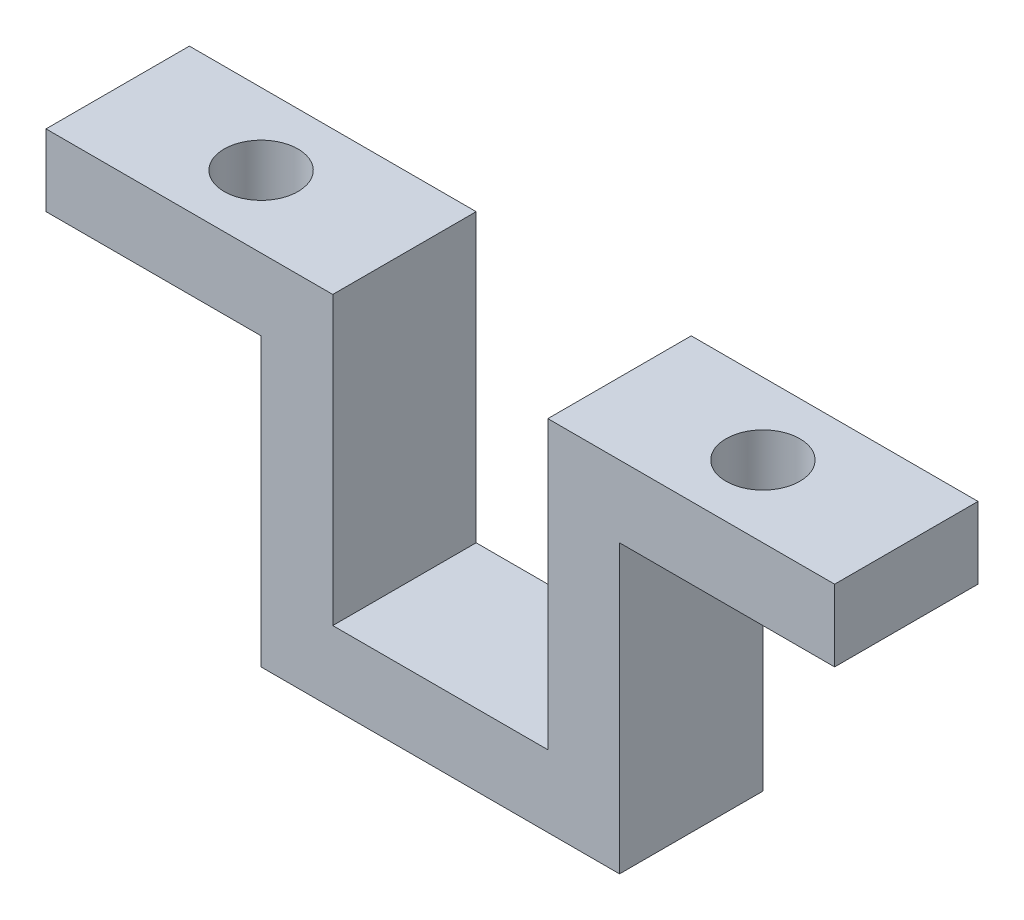
ISO-10303-21;
HEADER;
FILE_DESCRIPTION(('STEP AP214'),'2;1');
FILE_NAME('part.step','',(''),(''),'','','');
FILE_SCHEMA(('AUTOMOTIVE_DESIGN { 1 0 10303 214 1 1 1 1 }'));
ENDSEC;
DATA;
#1=APPLICATION_CONTEXT('core data for automotive mechanical design processes');
#2=APPLICATION_PROTOCOL_DEFINITION('international standard','automotive_design',2000,#1);
#3=PRODUCT_CONTEXT('',#1,'mechanical');
#4=PRODUCT('Part','Part','',(#3));
#5=PRODUCT_RELATED_PRODUCT_CATEGORY('part','',(#4));
#6=PRODUCT_DEFINITION_FORMATION('','',#4);
#7=PRODUCT_DEFINITION_CONTEXT('part definition',#1,'design');
#8=PRODUCT_DEFINITION('design','',#6,#7);
#9=PRODUCT_DEFINITION_SHAPE('','',#8);
#10=(LENGTH_UNIT() NAMED_UNIT(*) SI_UNIT(.MILLI.,.METRE.));
#11=(NAMED_UNIT(*) PLANE_ANGLE_UNIT() SI_UNIT($,.RADIAN.));
#12=(NAMED_UNIT(*) SI_UNIT($,.STERADIAN.) SOLID_ANGLE_UNIT());
#13=UNCERTAINTY_MEASURE_WITH_UNIT(LENGTH_MEASURE(1.E-05),#10,'distance_accuracy_value','');
#14=(GEOMETRIC_REPRESENTATION_CONTEXT(3) GLOBAL_UNCERTAINTY_ASSIGNED_CONTEXT((#13)) GLOBAL_UNIT_ASSIGNED_CONTEXT((#10,
#11,#12)) REPRESENTATION_CONTEXT('',''));
#15=CARTESIAN_POINT('',(0.,0.,0.));
#16=DIRECTION('',(0.,0.,1.));
#17=DIRECTION('',(1.,0.,0.));
#18=AXIS2_PLACEMENT_3D('',#15,#16,#17);
#19=CARTESIAN_POINT('',(20.,0.,10.));
#20=DIRECTION('',(-1.,0.,0.));
#21=DIRECTION('',(0.,-1.,0.));
#22=AXIS2_PLACEMENT_3D('',#19,#20,#21);
#23=PLANE('',#22);
#24=DIRECTION('',(0.,1.,0.));
#25=VECTOR('',#24,1.);
#26=CARTESIAN_POINT('',(20.,0.,0.));
#27=LINE('',#26,#25);
#28=CARTESIAN_POINT('',(20.,-20.,0.));
#29=VERTEX_POINT('',#28);
#30=CARTESIAN_POINT('',(20.,0.,0.));
#31=VERTEX_POINT('',#30);
#32=EDGE_CURVE('E169',#29,#31,#27,.T.);
#33=ORIENTED_EDGE('',*,*,#32,.T.);
#34=DIRECTION('',(0.,0.,-1.));
#35=VECTOR('',#34,1.);
#36=CARTESIAN_POINT('',(20.,0.,10.));
#37=LINE('',#36,#35);
#38=CARTESIAN_POINT('',(20.,0.,10.));
#39=VERTEX_POINT('',#38);
#40=EDGE_CURVE('E11',#39,#31,#37,.T.);
#41=ORIENTED_EDGE('',*,*,#40,.F.);
#42=DIRECTION('',(0.,1.,0.));
#43=VECTOR('',#42,1.);
#44=CARTESIAN_POINT('',(20.,0.,10.));
#45=LINE('',#44,#43);
#46=CARTESIAN_POINT('',(20.,-20.,10.));
#47=VERTEX_POINT('',#46);
#48=EDGE_CURVE('E203',#47,#39,#45,.T.);
#49=ORIENTED_EDGE('',*,*,#48,.F.);
#50=DIRECTION('',(0.,0.,-1.));
#51=VECTOR('',#50,1.);
#52=CARTESIAN_POINT('',(20.,-20.,10.));
#53=LINE('',#52,#51);
#54=EDGE_CURVE('E165',#47,#29,#53,.T.);
#55=ORIENTED_EDGE('',*,*,#54,.T.);
#56=EDGE_LOOP('',(#33,#41,#49,#55));
#57=FACE_BOUND('',#56,.T.);
#58=ADVANCED_FACE('F43',(#57),#23,.F.);
#59=CARTESIAN_POINT('',(0.,0.,10.));
#60=DIRECTION('',(0.,-1.,0.));
#61=DIRECTION('',(1.,0.,0.));
#62=AXIS2_PLACEMENT_3D('',#59,#60,#61);
#63=PLANE('',#62);
#64=CARTESIAN_POINT('',(10.,0.,5.));
#65=DIRECTION('',(0.,1.,0.));
#66=DIRECTION('',(-1.,0.,0.));
#67=AXIS2_PLACEMENT_3D('',#64,#65,#66);
#68=CIRCLE('',#67,2.575);
#69=CARTESIAN_POINT('',(7.425,0.,5.));
#70=VERTEX_POINT('',#69);
#71=EDGE_CURVE('E336',#70,#70,#68,.T.);
#72=ORIENTED_EDGE('',*,*,#71,.F.);
#73=EDGE_LOOP('',(#72));
#74=FACE_BOUND('',#73,.T.);
#75=DIRECTION('',(-1.,0.,0.));
#76=VECTOR('',#75,1.);
#77=CARTESIAN_POINT('',(0.,0.,0.));
#78=LINE('',#77,#76);
#79=CARTESIAN_POINT('',(0.,0.,0.));
#80=VERTEX_POINT('',#79);
#81=EDGE_CURVE('E173',#31,#80,#78,.T.);
#82=ORIENTED_EDGE('',*,*,#81,.T.);
#83=DIRECTION('',(0.,0.,-1.));
#84=VECTOR('',#83,1.);
#85=CARTESIAN_POINT('',(0.,0.,10.));
#86=LINE('',#85,#84);
#87=CARTESIAN_POINT('',(0.,0.,10.));
#88=VERTEX_POINT('',#87);
#89=EDGE_CURVE('E53',#88,#80,#86,.T.);
#90=ORIENTED_EDGE('',*,*,#89,.F.);
#91=DIRECTION('',(-1.,0.,0.));
#92=VECTOR('',#91,1.);
#93=CARTESIAN_POINT('',(0.,0.,10.));
#94=LINE('',#93,#92);
#95=EDGE_CURVE('E116',#39,#88,#94,.T.);
#96=ORIENTED_EDGE('',*,*,#95,.F.);
#97=ORIENTED_EDGE('',*,*,#40,.T.);
#98=EDGE_LOOP('',(#82,#90,#96,#97));
#99=FACE_BOUND('',#98,.T.);
#100=ADVANCED_FACE('F298',(#74,#99),#63,.F.);
#101=CARTESIAN_POINT('',(0.,0.,10.));
#102=DIRECTION('',(1.,0.,0.));
#103=DIRECTION('',(0.,1.,0.));
#104=AXIS2_PLACEMENT_3D('',#101,#102,#103);
#105=PLANE('',#104);
#106=DIRECTION('',(0.,-1.,0.));
#107=VECTOR('',#106,1.);
#108=CARTESIAN_POINT('',(0.,0.,0.));
#109=LINE('',#108,#107);
#110=CARTESIAN_POINT('',(0.,-5.,0.));
#111=VERTEX_POINT('',#110);
#112=EDGE_CURVE('E176',#80,#111,#109,.T.);
#113=ORIENTED_EDGE('',*,*,#112,.T.);
#114=DIRECTION('',(0.,0.,-1.));
#115=VECTOR('',#114,1.);
#116=CARTESIAN_POINT('',(0.,-5.,10.));
#117=LINE('',#116,#115);
#118=CARTESIAN_POINT('',(0.,-5.,10.));
#119=VERTEX_POINT('',#118);
#120=EDGE_CURVE('E230',#119,#111,#117,.T.);
#121=ORIENTED_EDGE('',*,*,#120,.F.);
#122=DIRECTION('',(0.,-1.,0.));
#123=VECTOR('',#122,1.);
#124=CARTESIAN_POINT('',(0.,0.,10.));
#125=LINE('',#124,#123);
#126=EDGE_CURVE('E241',#88,#119,#125,.T.);
#127=ORIENTED_EDGE('',*,*,#126,.F.);
#128=ORIENTED_EDGE('',*,*,#89,.T.);
#129=EDGE_LOOP('',(#113,#121,#127,#128));
#130=FACE_BOUND('',#129,.T.);
#131=ADVANCED_FACE('F239',(#130),#105,.F.);
#132=CARTESIAN_POINT('',(15.,-5.,10.));
#133=DIRECTION('',(0.,1.,0.));
#134=DIRECTION('',(-1.,0.,0.));
#135=AXIS2_PLACEMENT_3D('',#132,#133,#134);
#136=PLANE('',#135);
#137=CARTESIAN_POINT('',(10.,-5.,5.));
#138=DIRECTION('',(0.,1.,0.));
#139=DIRECTION('',(-1.,0.,0.));
#140=AXIS2_PLACEMENT_3D('',#137,#138,#139);
#141=CIRCLE('',#140,2.575);
#142=CARTESIAN_POINT('',(7.425,-5.,5.));
#143=VERTEX_POINT('',#142);
#144=EDGE_CURVE('E46',#143,#143,#141,.T.);
#145=ORIENTED_EDGE('',*,*,#144,.T.);
#146=EDGE_LOOP('',(#145));
#147=FACE_BOUND('',#146,.T.);
#148=DIRECTION('',(1.,0.,0.));
#149=VECTOR('',#148,1.);
#150=CARTESIAN_POINT('',(15.,-5.,0.));
#151=LINE('',#150,#149);
#152=CARTESIAN_POINT('',(15.,-5.,0.));
#153=VERTEX_POINT('',#152);
#154=EDGE_CURVE('E179',#111,#153,#151,.T.);
#155=ORIENTED_EDGE('',*,*,#154,.T.);
#156=DIRECTION('',(0.,0.,-1.));
#157=VECTOR('',#156,1.);
#158=CARTESIAN_POINT('',(15.,-5.,10.));
#159=LINE('',#158,#157);
#160=CARTESIAN_POINT('',(15.,-5.,10.));
#161=VERTEX_POINT('',#160);
#162=EDGE_CURVE('E226',#161,#153,#159,.T.);
#163=ORIENTED_EDGE('',*,*,#162,.F.);
#164=DIRECTION('',(1.,0.,0.));
#165=VECTOR('',#164,1.);
#166=CARTESIAN_POINT('',(15.,-5.,10.));
#167=LINE('',#166,#165);
#168=EDGE_CURVE('E260',#119,#161,#167,.T.);
#169=ORIENTED_EDGE('',*,*,#168,.F.);
#170=ORIENTED_EDGE('',*,*,#120,.T.);
#171=EDGE_LOOP('',(#155,#163,#169,#170));
#172=FACE_BOUND('',#171,.T.);
#173=ADVANCED_FACE('F250',(#147,#172),#136,.F.);
#174=CARTESIAN_POINT('',(15.,-25.,10.));
#175=DIRECTION('',(1.,0.,0.));
#176=DIRECTION('',(0.,0.,-1.));
#177=AXIS2_PLACEMENT_3D('',#174,#175,#176);
#178=PLANE('',#177);
#179=DIRECTION('',(0.,-1.,0.));
#180=VECTOR('',#179,1.);
#181=CARTESIAN_POINT('',(15.,-25.,0.));
#182=LINE('',#181,#180);
#183=CARTESIAN_POINT('',(15.,-25.,0.));
#184=VERTEX_POINT('',#183);
#185=EDGE_CURVE('E182',#153,#184,#182,.T.);
#186=ORIENTED_EDGE('',*,*,#185,.T.);
#187=DIRECTION('',(0.,0.,-1.));
#188=VECTOR('',#187,1.);
#189=CARTESIAN_POINT('',(15.,-25.,10.));
#190=LINE('',#189,#188);
#191=CARTESIAN_POINT('',(15.,-25.,10.));
#192=VERTEX_POINT('',#191);
#193=EDGE_CURVE('E222',#192,#184,#190,.T.);
#194=ORIENTED_EDGE('',*,*,#193,.F.);
#195=DIRECTION('',(0.,-1.,0.));
#196=VECTOR('',#195,1.);
#197=CARTESIAN_POINT('',(15.,-25.,10.));
#198=LINE('',#197,#196);
#199=EDGE_CURVE('E256',#161,#192,#198,.T.);
#200=ORIENTED_EDGE('',*,*,#199,.F.);
#201=ORIENTED_EDGE('',*,*,#162,.T.);
#202=EDGE_LOOP('',(#186,#194,#200,#201));
#203=FACE_BOUND('',#202,.T.);
#204=ADVANCED_FACE('F254',(#203),#178,.F.);
#205=CARTESIAN_POINT('',(40.,-25.,10.));
#206=DIRECTION('',(0.,1.,0.));
#207=DIRECTION('',(-1.,0.,0.));
#208=AXIS2_PLACEMENT_3D('',#205,#206,#207);
#209=PLANE('',#208);
#210=DIRECTION('',(1.,0.,0.));
#211=VECTOR('',#210,1.);
#212=CARTESIAN_POINT('',(40.,-25.,0.));
#213=LINE('',#212,#211);
#214=CARTESIAN_POINT('',(40.,-25.,0.));
#215=VERTEX_POINT('',#214);
#216=EDGE_CURVE('E185',#184,#215,#213,.T.);
#217=ORIENTED_EDGE('',*,*,#216,.T.);
#218=DIRECTION('',(0.,0.,-1.));
#219=VECTOR('',#218,1.);
#220=CARTESIAN_POINT('',(40.,-25.,10.));
#221=LINE('',#220,#219);
#222=CARTESIAN_POINT('',(40.,-25.,10.));
#223=VERTEX_POINT('',#222);
#224=EDGE_CURVE('E218',#223,#215,#221,.T.);
#225=ORIENTED_EDGE('',*,*,#224,.F.);
#226=DIRECTION('',(1.,0.,0.));
#227=VECTOR('',#226,1.);
#228=CARTESIAN_POINT('',(40.,-25.,10.));
#229=LINE('',#228,#227);
#230=EDGE_CURVE('E259',#192,#223,#229,.T.);
#231=ORIENTED_EDGE('',*,*,#230,.F.);
#232=ORIENTED_EDGE('',*,*,#193,.T.);
#233=EDGE_LOOP('',(#217,#225,#231,#232));
#234=FACE_BOUND('',#233,.T.);
#235=ADVANCED_FACE('F314',(#234),#209,.F.);
#236=CARTESIAN_POINT('',(40.,-5.,10.));
#237=DIRECTION('',(-1.,0.,0.));
#238=DIRECTION('',(0.,0.,1.));
#239=AXIS2_PLACEMENT_3D('',#236,#237,#238);
#240=PLANE('',#239);
#241=DIRECTION('',(0.,1.,0.));
#242=VECTOR('',#241,1.);
#243=CARTESIAN_POINT('',(40.,-5.,0.));
#244=LINE('',#243,#242);
#245=CARTESIAN_POINT('',(40.,-5.,0.));
#246=VERTEX_POINT('',#245);
#247=EDGE_CURVE('E188',#215,#246,#244,.T.);
#248=ORIENTED_EDGE('',*,*,#247,.T.);
#249=DIRECTION('',(0.,0.,-1.));
#250=VECTOR('',#249,1.);
#251=CARTESIAN_POINT('',(40.,-5.,10.));
#252=LINE('',#251,#250);
#253=CARTESIAN_POINT('',(40.,-5.,10.));
#254=VERTEX_POINT('',#253);
#255=EDGE_CURVE('E214',#254,#246,#252,.T.);
#256=ORIENTED_EDGE('',*,*,#255,.F.);
#257=DIRECTION('',(0.,1.,0.));
#258=VECTOR('',#257,1.);
#259=CARTESIAN_POINT('',(40.,-5.,10.));
#260=LINE('',#259,#258);
#261=EDGE_CURVE('E264',#223,#254,#260,.T.);
#262=ORIENTED_EDGE('',*,*,#261,.F.);
#263=ORIENTED_EDGE('',*,*,#224,.T.);
#264=EDGE_LOOP('',(#248,#256,#262,#263));
#265=FACE_BOUND('',#264,.T.);
#266=ADVANCED_FACE('F317',(#265),#240,.F.);
#267=CARTESIAN_POINT('',(40.,-5.,10.));
#268=DIRECTION('',(0.,1.,0.));
#269=DIRECTION('',(-1.,0.,0.));
#270=AXIS2_PLACEMENT_3D('',#267,#268,#269);
#271=PLANE('',#270);
#272=CARTESIAN_POINT('',(45.,-5.,5.));
#273=DIRECTION('',(0.,1.,0.));
#274=DIRECTION('',(-1.,0.,0.));
#275=AXIS2_PLACEMENT_3D('',#272,#273,#274);
#276=CIRCLE('',#275,2.57500000000001);
#277=CARTESIAN_POINT('',(42.425,-5.,5.));
#278=VERTEX_POINT('',#277);
#279=EDGE_CURVE('E340',#278,#278,#276,.T.);
#280=ORIENTED_EDGE('',*,*,#279,.T.);
#281=EDGE_LOOP('',(#280));
#282=FACE_BOUND('',#281,.T.);
#283=DIRECTION('',(1.,0.,0.));
#284=VECTOR('',#283,1.);
#285=CARTESIAN_POINT('',(40.,-5.,0.));
#286=LINE('',#285,#284);
#287=CARTESIAN_POINT('',(55.,-5.,0.));
#288=VERTEX_POINT('',#287);
#289=EDGE_CURVE('E191',#246,#288,#286,.T.);
#290=ORIENTED_EDGE('',*,*,#289,.T.);
#291=DIRECTION('',(0.,0.,-1.));
#292=VECTOR('',#291,1.);
#293=CARTESIAN_POINT('',(55.,-5.,10.));
#294=LINE('',#293,#292);
#295=CARTESIAN_POINT('',(55.,-5.,10.));
#296=VERTEX_POINT('',#295);
#297=EDGE_CURVE('E210',#296,#288,#294,.T.);
#298=ORIENTED_EDGE('',*,*,#297,.F.);
#299=DIRECTION('',(1.,0.,0.));
#300=VECTOR('',#299,1.);
#301=CARTESIAN_POINT('',(40.,-5.,10.));
#302=LINE('',#301,#300);
#303=EDGE_CURVE('E271',#254,#296,#302,.T.);
#304=ORIENTED_EDGE('',*,*,#303,.F.);
#305=ORIENTED_EDGE('',*,*,#255,.T.);
#306=EDGE_LOOP('',(#290,#298,#304,#305));
#307=FACE_BOUND('',#306,.T.);
#308=ADVANCED_FACE('F279',(#282,#307),#271,.F.);
#309=CARTESIAN_POINT('',(55.,0.,10.));
#310=DIRECTION('',(-1.,0.,0.));
#311=DIRECTION('',(0.,0.,1.));
#312=AXIS2_PLACEMENT_3D('',#309,#310,#311);
#313=PLANE('',#312);
#314=DIRECTION('',(0.,1.,0.));
#315=VECTOR('',#314,1.);
#316=CARTESIAN_POINT('',(55.,0.,0.));
#317=LINE('',#316,#315);
#318=CARTESIAN_POINT('',(55.,0.,0.));
#319=VERTEX_POINT('',#318);
#320=EDGE_CURVE('E194',#288,#319,#317,.T.);
#321=ORIENTED_EDGE('',*,*,#320,.T.);
#322=DIRECTION('',(0.,0.,-1.));
#323=VECTOR('',#322,1.);
#324=CARTESIAN_POINT('',(55.,0.,10.));
#325=LINE('',#324,#323);
#326=CARTESIAN_POINT('',(55.,0.,10.));
#327=VERTEX_POINT('',#326);
#328=EDGE_CURVE('E158',#327,#319,#325,.T.);
#329=ORIENTED_EDGE('',*,*,#328,.F.);
#330=DIRECTION('',(0.,1.,0.));
#331=VECTOR('',#330,1.);
#332=CARTESIAN_POINT('',(55.,0.,10.));
#333=LINE('',#332,#331);
#334=EDGE_CURVE('E147',#296,#327,#333,.T.);
#335=ORIENTED_EDGE('',*,*,#334,.F.);
#336=ORIENTED_EDGE('',*,*,#297,.T.);
#337=EDGE_LOOP('',(#321,#329,#335,#336));
#338=FACE_BOUND('',#337,.T.);
#339=ADVANCED_FACE('F283',(#338),#313,.F.);
#340=CARTESIAN_POINT('',(35.,0.,10.));
#341=DIRECTION('',(0.,-1.,0.));
#342=DIRECTION('',(1.,0.,0.));
#343=AXIS2_PLACEMENT_3D('',#340,#341,#342);
#344=PLANE('',#343);
#345=CARTESIAN_POINT('',(45.,0.,5.));
#346=DIRECTION('',(0.,1.,0.));
#347=DIRECTION('',(1.,0.,0.));
#348=AXIS2_PLACEMENT_3D('',#345,#346,#347);
#349=CIRCLE('',#348,2.57500000000001);
#350=CARTESIAN_POINT('',(47.575,0.,5.));
#351=VERTEX_POINT('',#350);
#352=EDGE_CURVE('E333',#351,#351,#349,.T.);
#353=ORIENTED_EDGE('',*,*,#352,.F.);
#354=EDGE_LOOP('',(#353));
#355=FACE_BOUND('',#354,.T.);
#356=DIRECTION('',(-1.,0.,0.));
#357=VECTOR('',#356,1.);
#358=CARTESIAN_POINT('',(35.,0.,0.));
#359=LINE('',#358,#357);
#360=CARTESIAN_POINT('',(35.,0.,0.));
#361=VERTEX_POINT('',#360);
#362=EDGE_CURVE('E156',#319,#361,#359,.T.);
#363=ORIENTED_EDGE('',*,*,#362,.T.);
#364=DIRECTION('',(0.,0.,-1.));
#365=VECTOR('',#364,1.);
#366=CARTESIAN_POINT('',(35.,0.,10.));
#367=LINE('',#366,#365);
#368=CARTESIAN_POINT('',(35.,0.,10.));
#369=VERTEX_POINT('',#368);
#370=EDGE_CURVE('E153',#369,#361,#367,.T.);
#371=ORIENTED_EDGE('',*,*,#370,.F.);
#372=DIRECTION('',(-1.,0.,0.));
#373=VECTOR('',#372,1.);
#374=CARTESIAN_POINT('',(35.,0.,10.));
#375=LINE('',#374,#373);
#376=EDGE_CURVE('E141',#327,#369,#375,.T.);
#377=ORIENTED_EDGE('',*,*,#376,.F.);
#378=ORIENTED_EDGE('',*,*,#328,.T.);
#379=EDGE_LOOP('',(#363,#371,#377,#378));
#380=FACE_BOUND('',#379,.T.);
#381=ADVANCED_FACE('F154',(#355,#380),#344,.F.);
#382=CARTESIAN_POINT('',(35.,-20.,10.));
#383=DIRECTION('',(1.,0.,0.));
#384=DIRECTION('',(0.,0.,-1.));
#385=AXIS2_PLACEMENT_3D('',#382,#383,#384);
#386=PLANE('',#385);
#387=DIRECTION('',(0.,-1.,0.));
#388=VECTOR('',#387,1.);
#389=CARTESIAN_POINT('',(35.,-20.,0.));
#390=LINE('',#389,#388);
#391=CARTESIAN_POINT('',(35.,-20.,0.));
#392=VERTEX_POINT('',#391);
#393=EDGE_CURVE('E102',#361,#392,#390,.T.);
#394=ORIENTED_EDGE('',*,*,#393,.T.);
#395=DIRECTION('',(0.,0.,-1.));
#396=VECTOR('',#395,1.);
#397=CARTESIAN_POINT('',(35.,-20.,10.));
#398=LINE('',#397,#396);
#399=CARTESIAN_POINT('',(35.,-20.,10.));
#400=VERTEX_POINT('',#399);
#401=EDGE_CURVE('E159',#400,#392,#398,.T.);
#402=ORIENTED_EDGE('',*,*,#401,.F.);
#403=DIRECTION('',(0.,-1.,0.));
#404=VECTOR('',#403,1.);
#405=CARTESIAN_POINT('',(35.,-20.,10.));
#406=LINE('',#405,#404);
#407=EDGE_CURVE('E145',#369,#400,#406,.T.);
#408=ORIENTED_EDGE('',*,*,#407,.F.);
#409=ORIENTED_EDGE('',*,*,#370,.T.);
#410=EDGE_LOOP('',(#394,#402,#408,#409));
#411=FACE_BOUND('',#410,.T.);
#412=ADVANCED_FACE('F161',(#411),#386,.F.);
#413=CARTESIAN_POINT('',(20.,-20.,10.));
#414=DIRECTION('',(0.,-1.,0.));
#415=DIRECTION('',(0.,0.,-1.));
#416=AXIS2_PLACEMENT_3D('',#413,#414,#415);
#417=PLANE('',#416);
#418=DIRECTION('',(-1.,0.,0.));
#419=VECTOR('',#418,1.);
#420=CARTESIAN_POINT('',(20.,-20.,0.));
#421=LINE('',#420,#419);
#422=EDGE_CURVE('E108',#392,#29,#421,.T.);
#423=ORIENTED_EDGE('',*,*,#422,.T.);
#424=ORIENTED_EDGE('',*,*,#54,.F.);
#425=DIRECTION('',(-1.,0.,0.));
#426=VECTOR('',#425,1.);
#427=CARTESIAN_POINT('',(20.,-20.,10.));
#428=LINE('',#427,#426);
#429=EDGE_CURVE('E61',#400,#47,#428,.T.);
#430=ORIENTED_EDGE('',*,*,#429,.F.);
#431=ORIENTED_EDGE('',*,*,#401,.T.);
#432=EDGE_LOOP('',(#423,#424,#430,#431));
#433=FACE_BOUND('',#432,.T.);
#434=ADVANCED_FACE('F287',(#433),#417,.F.);
#435=CARTESIAN_POINT('',(0.,0.,10.));
#436=DIRECTION('',(0.,0.,1.));
#437=DIRECTION('',(1.,0.,0.));
#438=AXIS2_PLACEMENT_3D('',#435,#436,#437);
#439=PLANE('',#438);
#440=ORIENTED_EDGE('',*,*,#48,.T.);
#441=ORIENTED_EDGE('',*,*,#95,.T.);
#442=ORIENTED_EDGE('',*,*,#126,.T.);
#443=ORIENTED_EDGE('',*,*,#168,.T.);
#444=ORIENTED_EDGE('',*,*,#199,.T.);
#445=ORIENTED_EDGE('',*,*,#230,.T.);
#446=ORIENTED_EDGE('',*,*,#261,.T.);
#447=ORIENTED_EDGE('',*,*,#303,.T.);
#448=ORIENTED_EDGE('',*,*,#334,.T.);
#449=ORIENTED_EDGE('',*,*,#376,.T.);
#450=ORIENTED_EDGE('',*,*,#407,.T.);
#451=ORIENTED_EDGE('',*,*,#429,.T.);
#452=EDGE_LOOP('',(#440,#441,#442,#443,#444,#445,#446,#447,#448,#449,#450,#451));
#453=FACE_BOUND('',#452,.T.);
#454=ADVANCED_FACE('F143',(#453),#439,.T.);
#455=CARTESIAN_POINT('',(0.,0.,0.));
#456=DIRECTION('',(0.,0.,1.));
#457=DIRECTION('',(1.,0.,0.));
#458=AXIS2_PLACEMENT_3D('',#455,#456,#457);
#459=PLANE('',#458);
#460=ORIENTED_EDGE('',*,*,#32,.F.);
#461=ORIENTED_EDGE('',*,*,#422,.F.);
#462=ORIENTED_EDGE('',*,*,#393,.F.);
#463=ORIENTED_EDGE('',*,*,#362,.F.);
#464=ORIENTED_EDGE('',*,*,#320,.F.);
#465=ORIENTED_EDGE('',*,*,#289,.F.);
#466=ORIENTED_EDGE('',*,*,#247,.F.);
#467=ORIENTED_EDGE('',*,*,#216,.F.);
#468=ORIENTED_EDGE('',*,*,#185,.F.);
#469=ORIENTED_EDGE('',*,*,#154,.F.);
#470=ORIENTED_EDGE('',*,*,#112,.F.);
#471=ORIENTED_EDGE('',*,*,#81,.F.);
#472=EDGE_LOOP('',(#460,#461,#462,#463,#464,#465,#466,#467,#468,#469,#470,#471));
#473=FACE_BOUND('',#472,.T.);
#474=ADVANCED_FACE('F245',(#473),#459,.F.);
#475=CARTESIAN_POINT('',(45.,-25.,5.));
#476=DIRECTION('',(0.,1.,0.));
#477=DIRECTION('',(-1.,0.,0.));
#478=AXIS2_PLACEMENT_3D('',#475,#476,#477);
#479=CYLINDRICAL_SURFACE('',#478,2.57500000000001);
#480=ORIENTED_EDGE('',*,*,#352,.T.);
#481=EDGE_LOOP('',(#480));
#482=FACE_BOUND('',#481,.T.);
#483=ORIENTED_EDGE('',*,*,#279,.F.);
#484=EDGE_LOOP('',(#483));
#485=FACE_BOUND('',#484,.T.);
#486=ADVANCED_FACE('F356',(#482,#485),#479,.F.);
#487=CARTESIAN_POINT('',(10.,-25.,5.));
#488=DIRECTION('',(0.,1.,0.));
#489=DIRECTION('',(-1.,0.,0.));
#490=AXIS2_PLACEMENT_3D('',#487,#488,#489);
#491=CYLINDRICAL_SURFACE('',#490,2.575);
#492=ORIENTED_EDGE('',*,*,#71,.T.);
#493=EDGE_LOOP('',(#492));
#494=FACE_BOUND('',#493,.T.);
#495=ORIENTED_EDGE('',*,*,#144,.F.);
#496=EDGE_LOOP('',(#495));
#497=FACE_BOUND('',#496,.T.);
#498=ADVANCED_FACE('F354',(#494,#497),#491,.F.);
#499=CLOSED_SHELL('',(#58,#100,#131,#173,#204,#235,#266,#308,#339,#381,#412,#434,#454,#474,#486,#498));
#500=MANIFOLD_SOLID_BREP('B2',#499);
#501=ADVANCED_BREP_SHAPE_REPRESENTATION('',(#18,#500),#14);
#502=SHAPE_DEFINITION_REPRESENTATION(#9,#501);
ENDSEC;
END-ISO-10303-21;
